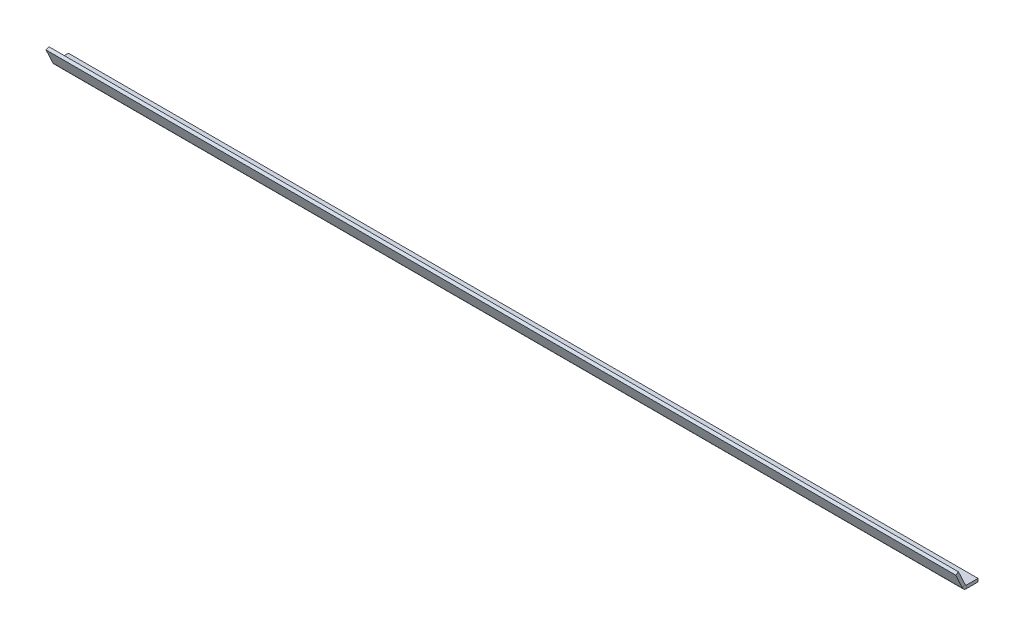
ISO-10303-21;
HEADER;
FILE_DESCRIPTION(('STEP AP214'),'2;1');
FILE_NAME('part.step','',(''),(''),'','','');
FILE_SCHEMA(('AUTOMOTIVE_DESIGN { 1 0 10303 214 1 1 1 1 }'));
ENDSEC;
DATA;
#1=APPLICATION_CONTEXT('core data for automotive mechanical design processes');
#2=APPLICATION_PROTOCOL_DEFINITION('international standard','automotive_design',2000,#1);
#3=PRODUCT_CONTEXT('',#1,'mechanical');
#4=PRODUCT('Part','Part','',(#3));
#5=PRODUCT_RELATED_PRODUCT_CATEGORY('part','',(#4));
#6=PRODUCT_DEFINITION_FORMATION('','',#4);
#7=PRODUCT_DEFINITION_CONTEXT('part definition',#1,'design');
#8=PRODUCT_DEFINITION('design','',#6,#7);
#9=PRODUCT_DEFINITION_SHAPE('','',#8);
#10=(LENGTH_UNIT() NAMED_UNIT(*) SI_UNIT(.MILLI.,.METRE.));
#11=(NAMED_UNIT(*) PLANE_ANGLE_UNIT() SI_UNIT($,.RADIAN.));
#12=(NAMED_UNIT(*) SI_UNIT($,.STERADIAN.) SOLID_ANGLE_UNIT());
#13=UNCERTAINTY_MEASURE_WITH_UNIT(LENGTH_MEASURE(1.E-05),#10,'distance_accuracy_value','');
#14=(GEOMETRIC_REPRESENTATION_CONTEXT(3) GLOBAL_UNCERTAINTY_ASSIGNED_CONTEXT((#13)) GLOBAL_UNIT_ASSIGNED_CONTEXT((#10,
#11,#12)) REPRESENTATION_CONTEXT('',''));
#15=CARTESIAN_POINT('',(0.,0.,0.));
#16=DIRECTION('',(0.,0.,1.));
#17=DIRECTION('',(1.,0.,0.));
#18=AXIS2_PLACEMENT_3D('',#15,#16,#17);
#19=CARTESIAN_POINT('',(1150.,-8.,-2.15248500708152E-13));
#20=DIRECTION('',(1.,0.,0.));
#21=DIRECTION('',(0.,0.,-1.));
#22=AXIS2_PLACEMENT_3D('',#19,#20,#21);
#23=PLANE('',#22);
#24=DIRECTION('',(0.,0.,-1.));
#25=VECTOR('',#24,1.);
#26=CARTESIAN_POINT('',(1150.,0.,-2.15248500708152E-13));
#27=LINE('',#26,#25);
#28=CARTESIAN_POINT('',(1150.,0.,-10.7382341341226));
#29=VERTEX_POINT('',#28);
#30=CARTESIAN_POINT('',(1150.,0.,-40.0000000000002));
#31=VERTEX_POINT('',#30);
#32=EDGE_CURVE('E113',#29,#31,#27,.T.);
#33=ORIENTED_EDGE('',*,*,#32,.F.);
#34=DIRECTION('',(0.,-1.,0.));
#35=VECTOR('',#34,1.);
#36=CARTESIAN_POINT('',(1150.,-1.44415729375069E-13,-10.7382341341226));
#37=LINE('',#36,#35);
#38=CARTESIAN_POINT('',(1150.,-8.00000000000015,-10.738234134123));
#39=VERTEX_POINT('',#38);
#40=EDGE_CURVE('E128',#29,#39,#37,.T.);
#41=ORIENTED_EDGE('',*,*,#40,.T.);
#42=DIRECTION('',(0.,0.,-1.));
#43=VECTOR('',#42,1.);
#44=CARTESIAN_POINT('',(1150.,-8.,-2.15248500708152E-13));
#45=LINE('',#44,#43);
#46=CARTESIAN_POINT('',(1150.,-8.,-40.0000000000002));
#47=VERTEX_POINT('',#46);
#48=EDGE_CURVE('E110',#39,#47,#45,.T.);
#49=ORIENTED_EDGE('',*,*,#48,.T.);
#50=DIRECTION('',(0.,1.,0.));
#51=VECTOR('',#50,1.);
#52=CARTESIAN_POINT('',(1150.,-8.,-40.0000000000002));
#53=LINE('',#52,#51);
#54=EDGE_CURVE('E66',#47,#31,#53,.T.);
#55=ORIENTED_EDGE('',*,*,#54,.T.);
#56=EDGE_LOOP('',(#33,#41,#49,#55));
#57=FACE_BOUND('',#56,.T.);
#58=ADVANCED_FACE('F63',(#57),#23,.T.);
#59=CARTESIAN_POINT('',(0.,-8.,0.));
#60=DIRECTION('',(0.,1.,0.));
#61=DIRECTION('',(0.,0.,1.));
#62=AXIS2_PLACEMENT_3D('',#59,#60,#61);
#63=PLANE('',#62);
#64=DIRECTION('',(1.,0.,0.));
#65=VECTOR('',#64,1.);
#66=CARTESIAN_POINT('',(1150.,-8.00000000000015,-10.738234134123));
#67=LINE('',#66,#65);
#68=CARTESIAN_POINT('',(-1150.,-8.,-10.7382341341226));
#69=VERTEX_POINT('',#68);
#70=EDGE_CURVE('E150',#39,#69,#67,.F.);
#71=ORIENTED_EDGE('',*,*,#70,.T.);
#72=DIRECTION('',(0.,0.,1.));
#73=VECTOR('',#72,1.);
#74=CARTESIAN_POINT('',(-1150.,-8.,0.));
#75=LINE('',#74,#73);
#76=CARTESIAN_POINT('',(-1150.,-8.,-39.9999999999999));
#77=VERTEX_POINT('',#76);
#78=EDGE_CURVE('E121',#77,#69,#75,.T.);
#79=ORIENTED_EDGE('',*,*,#78,.F.);
#80=DIRECTION('',(-1.,0.,0.));
#81=VECTOR('',#80,1.);
#82=CARTESIAN_POINT('',(1150.,-8.,-40.0000000000002));
#83=LINE('',#82,#81);
#84=EDGE_CURVE('E102',#47,#77,#83,.T.);
#85=ORIENTED_EDGE('',*,*,#84,.F.);
#86=ORIENTED_EDGE('',*,*,#48,.F.);
#87=EDGE_LOOP('',(#71,#79,#85,#86));
#88=FACE_BOUND('',#87,.T.);
#89=ADVANCED_FACE('F243',(#88),#63,.F.);
#90=CARTESIAN_POINT('',(0.,0.,0.));
#91=DIRECTION('',(0.,1.,0.));
#92=DIRECTION('',(0.,0.,1.));
#93=AXIS2_PLACEMENT_3D('',#90,#91,#92);
#94=PLANE('',#93);
#95=DIRECTION('',(0.,0.,1.));
#96=VECTOR('',#95,1.);
#97=CARTESIAN_POINT('',(-1150.,0.,0.));
#98=LINE('',#97,#96);
#99=CARTESIAN_POINT('',(-1150.,0.,-39.9999999999999));
#100=VERTEX_POINT('',#99);
#101=CARTESIAN_POINT('',(-1150.,-1.44415729375069E-13,-10.7382341341226));
#102=VERTEX_POINT('',#101);
#103=EDGE_CURVE('E104',#100,#102,#98,.T.);
#104=ORIENTED_EDGE('',*,*,#103,.T.);
#105=DIRECTION('',(1.,0.,0.));
#106=VECTOR('',#105,1.);
#107=CARTESIAN_POINT('',(1150.,-1.44415729375069E-13,-10.7382341341226));
#108=LINE('',#107,#106);
#109=EDGE_CURVE('E78',#29,#102,#108,.F.);
#110=ORIENTED_EDGE('',*,*,#109,.F.);
#111=ORIENTED_EDGE('',*,*,#32,.T.);
#112=DIRECTION('',(-1.,0.,0.));
#113=VECTOR('',#112,1.);
#114=CARTESIAN_POINT('',(1150.,0.,-40.0000000000002));
#115=LINE('',#114,#113);
#116=EDGE_CURVE('E100',#31,#100,#115,.T.);
#117=ORIENTED_EDGE('',*,*,#116,.T.);
#118=EDGE_LOOP('',(#104,#110,#111,#117));
#119=FACE_BOUND('',#118,.T.);
#120=ADVANCED_FACE('F112',(#119),#94,.T.);
#121=CARTESIAN_POINT('',(-1150.,-8.,0.));
#122=DIRECTION('',(-1.,0.,0.));
#123=DIRECTION('',(0.,0.,1.));
#124=AXIS2_PLACEMENT_3D('',#121,#122,#123);
#125=PLANE('',#124);
#126=DIRECTION('',(0.,-1.,0.));
#127=VECTOR('',#126,1.);
#128=CARTESIAN_POINT('',(-1150.,-1.44415729375069E-13,-10.7382341341226));
#129=LINE('',#128,#127);
#130=EDGE_CURVE('E108',#102,#69,#129,.T.);
#131=ORIENTED_EDGE('',*,*,#130,.F.);
#132=ORIENTED_EDGE('',*,*,#103,.F.);
#133=DIRECTION('',(0.,1.,0.));
#134=VECTOR('',#133,1.);
#135=CARTESIAN_POINT('',(-1150.,-8.,-39.9999999999999));
#136=LINE('',#135,#134);
#137=EDGE_CURVE('E13',#77,#100,#136,.T.);
#138=ORIENTED_EDGE('',*,*,#137,.F.);
#139=ORIENTED_EDGE('',*,*,#78,.T.);
#140=EDGE_LOOP('',(#131,#132,#138,#139));
#141=FACE_BOUND('',#140,.T.);
#142=ADVANCED_FACE('F105',(#141),#125,.T.);
#143=CARTESIAN_POINT('',(1150.,-8.,-40.0000000000002));
#144=DIRECTION('',(0.,0.,-1.));
#145=DIRECTION('',(-1.,0.,0.));
#146=AXIS2_PLACEMENT_3D('',#143,#144,#145);
#147=PLANE('',#146);
#148=ORIENTED_EDGE('',*,*,#116,.F.);
#149=ORIENTED_EDGE('',*,*,#54,.F.);
#150=ORIENTED_EDGE('',*,*,#84,.T.);
#151=ORIENTED_EDGE('',*,*,#137,.T.);
#152=EDGE_LOOP('',(#148,#149,#150,#151));
#153=FACE_BOUND('',#152,.T.);
#154=ADVANCED_FACE('F97',(#153),#147,.T.);
#155=CARTESIAN_POINT('',(-1150.,2.99999999999998,-10.7382341341224));
#156=DIRECTION('',(-1.,0.,0.));
#157=DIRECTION('',(0.,0.,1.));
#158=AXIS2_PLACEMENT_3D('',#155,#156,#157);
#159=PLANE('',#158);
#160=DIRECTION('',(0.,0.422618261740704,-0.906307787036648));
#161=VECTOR('',#160,1.);
#162=CARTESIAN_POINT('',(-1150.,-1.64880087914773,-0.768848476719149));
#163=LINE('',#162,#161);
#164=CARTESIAN_POINT('',(-1150.,1.73214521477782,-8.01931077301239));
#165=VERTEX_POINT('',#164);
#166=CARTESIAN_POINT('',(-1150.,-1.64880087914781,-0.768848476719203));
#167=VERTEX_POINT('',#166);
#168=EDGE_CURVE('E157',#165,#167,#163,.F.);
#169=ORIENTED_EDGE('',*,*,#168,.F.);
#170=CARTESIAN_POINT('',(-1150.,2.99999999999998,-10.7382341341224));
#171=DIRECTION('',(1.,0.,0.));
#172=DIRECTION('',(0.,0.,-1.));
#173=AXIS2_PLACEMENT_3D('',#170,#171,#172);
#174=CIRCLE('',#173,3.00000000000013);
#175=EDGE_CURVE('E142',#102,#165,#174,.F.);
#176=ORIENTED_EDGE('',*,*,#175,.F.);
#177=ORIENTED_EDGE('',*,*,#130,.T.);
#178=CARTESIAN_POINT('',(-1150.,2.99999999999998,-10.7382341341224));
#179=DIRECTION('',(1.,0.,0.));
#180=DIRECTION('',(0.,0.,-1.));
#181=AXIS2_PLACEMENT_3D('',#178,#179,#180);
#182=CIRCLE('',#181,11.0000000000001);
#183=EDGE_CURVE('E132',#69,#167,#182,.F.);
#184=ORIENTED_EDGE('',*,*,#183,.T.);
#185=EDGE_LOOP('',(#169,#176,#177,#184));
#186=FACE_BOUND('',#185,.T.);
#187=ADVANCED_FACE('F247',(#186),#159,.T.);
#188=CARTESIAN_POINT('',(1150.,2.99999999999998,-10.7382341341224));
#189=DIRECTION('',(-1.,0.,0.));
#190=DIRECTION('',(0.,0.,1.));
#191=AXIS2_PLACEMENT_3D('',#188,#189,#190);
#192=PLANE('',#191);
#193=CARTESIAN_POINT('',(1150.,2.99999999999998,-10.7382341341224));
#194=DIRECTION('',(1.,0.,0.));
#195=DIRECTION('',(0.,0.,-1.));
#196=AXIS2_PLACEMENT_3D('',#193,#194,#195);
#197=CIRCLE('',#196,3.00000000000013);
#198=CARTESIAN_POINT('',(1150.,1.73214521477782,-8.01931077301239));
#199=VERTEX_POINT('',#198);
#200=EDGE_CURVE('E135',#199,#29,#197,.T.);
#201=ORIENTED_EDGE('',*,*,#200,.F.);
#202=DIRECTION('',(0.,0.422618261740704,-0.906307787036648));
#203=VECTOR('',#202,1.);
#204=CARTESIAN_POINT('',(1150.,1.73214521477785,-8.01931077301267));
#205=LINE('',#204,#203);
#206=CARTESIAN_POINT('',(1150.,-1.6488008791478,-0.768848476719464));
#207=VERTEX_POINT('',#206);
#208=EDGE_CURVE('E165',#199,#207,#205,.F.);
#209=ORIENTED_EDGE('',*,*,#208,.T.);
#210=CARTESIAN_POINT('',(1150.,2.99999999999998,-10.7382341341224));
#211=DIRECTION('',(1.,0.,0.));
#212=DIRECTION('',(0.,0.,-1.));
#213=AXIS2_PLACEMENT_3D('',#210,#211,#212);
#214=CIRCLE('',#213,11.0000000000001);
#215=EDGE_CURVE('E146',#207,#39,#214,.T.);
#216=ORIENTED_EDGE('',*,*,#215,.T.);
#217=ORIENTED_EDGE('',*,*,#40,.F.);
#218=EDGE_LOOP('',(#201,#209,#216,#217));
#219=FACE_BOUND('',#218,.T.);
#220=ADVANCED_FACE('F257',(#219),#192,.F.);
#221=CARTESIAN_POINT('',(1150.,2.99999999999998,-10.7382341341224));
#222=DIRECTION('',(1.,0.,0.));
#223=DIRECTION('',(0.,-0.422618261740704,0.906307787036648));
#224=AXIS2_PLACEMENT_3D('',#221,#222,#223);
#225=CYLINDRICAL_SURFACE('',#224,11.0000000000001);
#226=ORIENTED_EDGE('',*,*,#70,.F.);
#227=ORIENTED_EDGE('',*,*,#215,.F.);
#228=DIRECTION('',(1.,0.,0.));
#229=VECTOR('',#228,1.);
#230=CARTESIAN_POINT('',(-1150.,-1.64880087914773,-0.768848476719148));
#231=LINE('',#230,#229);
#232=EDGE_CURVE('E169',#207,#167,#231,.F.);
#233=ORIENTED_EDGE('',*,*,#232,.T.);
#234=ORIENTED_EDGE('',*,*,#183,.F.);
#235=EDGE_LOOP('',(#226,#227,#233,#234));
#236=FACE_BOUND('',#235,.T.);
#237=ADVANCED_FACE('F248',(#236),#225,.T.);
#238=CARTESIAN_POINT('',(1150.,2.99999999999998,-10.7382341341224));
#239=DIRECTION('',(1.,0.,0.));
#240=DIRECTION('',(0.,-0.422618261740704,0.906307787036648));
#241=AXIS2_PLACEMENT_3D('',#238,#239,#240);
#242=CYLINDRICAL_SURFACE('',#241,3.00000000000013);
#243=ORIENTED_EDGE('',*,*,#109,.T.);
#244=ORIENTED_EDGE('',*,*,#175,.T.);
#245=DIRECTION('',(1.,0.,0.));
#246=VECTOR('',#245,1.);
#247=CARTESIAN_POINT('',(-1150.,1.73214521477791,-8.01931077301236));
#248=LINE('',#247,#246);
#249=EDGE_CURVE('E161',#165,#199,#248,.T.);
#250=ORIENTED_EDGE('',*,*,#249,.T.);
#251=ORIENTED_EDGE('',*,*,#200,.T.);
#252=EDGE_LOOP('',(#243,#244,#250,#251));
#253=FACE_BOUND('',#252,.T.);
#254=ADVANCED_FACE('F260',(#253),#242,.F.);
#255=CARTESIAN_POINT('',(-1150.,-3.38094609392566,-1.57656105540664));
#256=DIRECTION('',(1.,0.,0.));
#257=DIRECTION('',(0.,0.,-1.));
#258=AXIS2_PLACEMENT_3D('',#255,#256,#257);
#259=PLANE('',#258);
#260=ORIENTED_EDGE('',*,*,#168,.T.);
#261=DIRECTION('',(0.,-0.906307787036648,-0.422618261740704));
#262=VECTOR('',#261,1.);
#263=CARTESIAN_POINT('',(-1150.,-3.38094609392569,-1.57656105540665));
#264=LINE('',#263,#262);
#265=CARTESIAN_POINT('',(-1150.,35.5027737777591,16.5552152983139));
#266=VERTEX_POINT('',#265);
#267=EDGE_CURVE('E185',#266,#167,#264,.T.);
#268=ORIENTED_EDGE('',*,*,#267,.F.);
#269=DIRECTION('',(0.,0.422618261740704,-0.906307787036648));
#270=VECTOR('',#269,1.);
#271=CARTESIAN_POINT('',(-1150.,35.5027737777591,16.5552152983139));
#272=LINE('',#271,#270);
#273=CARTESIAN_POINT('',(-1150.,38.8837198716847,9.3047530020207));
#274=VERTEX_POINT('',#273);
#275=EDGE_CURVE('E197',#266,#274,#272,.T.);
#276=ORIENTED_EDGE('',*,*,#275,.T.);
#277=DIRECTION('',(0.,0.906307787036648,0.422618261740704));
#278=VECTOR('',#277,1.);
#279=CARTESIAN_POINT('',(-1150.,0.,-8.82702335169983));
#280=LINE('',#279,#278);
#281=EDGE_CURVE('E173',#274,#165,#280,.F.);
#282=ORIENTED_EDGE('',*,*,#281,.T.);
#283=EDGE_LOOP('',(#260,#268,#276,#282));
#284=FACE_BOUND('',#283,.T.);
#285=ADVANCED_FACE('F226',(#284),#259,.F.);
#286=CARTESIAN_POINT('',(1150.,35.5027737777591,16.5552152983136));
#287=DIRECTION('',(-1.,0.,0.));
#288=DIRECTION('',(0.,-1.,0.));
#289=AXIS2_PLACEMENT_3D('',#286,#287,#288);
#290=PLANE('',#289);
#291=ORIENTED_EDGE('',*,*,#208,.F.);
#292=DIRECTION('',(0.,-0.906307787036648,-0.422618261740704));
#293=VECTOR('',#292,1.);
#294=CARTESIAN_POINT('',(1150.,38.8837198716847,9.30475300202042));
#295=LINE('',#294,#293);
#296=CARTESIAN_POINT('',(1150.,38.8837198716847,9.30475300202042));
#297=VERTEX_POINT('',#296);
#298=EDGE_CURVE('E177',#199,#297,#295,.F.);
#299=ORIENTED_EDGE('',*,*,#298,.T.);
#300=DIRECTION('',(0.,0.422618261740704,-0.906307787036648));
#301=VECTOR('',#300,1.);
#302=CARTESIAN_POINT('',(1150.,35.5027737777591,16.5552152983136));
#303=LINE('',#302,#301);
#304=CARTESIAN_POINT('',(1150.,35.5027737777591,16.5552152983136));
#305=VERTEX_POINT('',#304);
#306=EDGE_CURVE('E139',#305,#297,#303,.T.);
#307=ORIENTED_EDGE('',*,*,#306,.F.);
#308=DIRECTION('',(0.,0.906307787036648,0.422618261740704));
#309=VECTOR('',#308,1.);
#310=CARTESIAN_POINT('',(1150.,-3.38094609392018,-1.57656105540437));
#311=LINE('',#310,#309);
#312=EDGE_CURVE('E189',#207,#305,#311,.T.);
#313=ORIENTED_EDGE('',*,*,#312,.F.);
#314=EDGE_LOOP('',(#291,#299,#307,#313));
#315=FACE_BOUND('',#314,.T.);
#316=ADVANCED_FACE('F254',(#315),#290,.F.);
#317=CARTESIAN_POINT('',(0.,-3.38094609392563,-1.57656105540677));
#318=DIRECTION('',(0.,0.422618261740704,-0.906307787036648));
#319=DIRECTION('',(0.,0.906307787036648,0.422618261740704));
#320=AXIS2_PLACEMENT_3D('',#317,#318,#319);
#321=PLANE('',#320);
#322=ORIENTED_EDGE('',*,*,#232,.F.);
#323=ORIENTED_EDGE('',*,*,#312,.T.);
#324=DIRECTION('',(-1.,0.,0.));
#325=VECTOR('',#324,1.);
#326=CARTESIAN_POINT('',(0.,35.5027737777591,16.5552152983137));
#327=LINE('',#326,#325);
#328=EDGE_CURVE('E193',#305,#266,#327,.T.);
#329=ORIENTED_EDGE('',*,*,#328,.T.);
#330=ORIENTED_EDGE('',*,*,#267,.T.);
#331=EDGE_LOOP('',(#322,#323,#329,#330));
#332=FACE_BOUND('',#331,.T.);
#333=ADVANCED_FACE('F251',(#332),#321,.F.);
#334=CARTESIAN_POINT('',(0.,0.,-8.82702335169995));
#335=DIRECTION('',(0.,0.422618261740704,-0.906307787036648));
#336=DIRECTION('',(0.,0.906307787036648,0.422618261740704));
#337=AXIS2_PLACEMENT_3D('',#334,#335,#336);
#338=PLANE('',#337);
#339=ORIENTED_EDGE('',*,*,#298,.F.);
#340=ORIENTED_EDGE('',*,*,#249,.F.);
#341=ORIENTED_EDGE('',*,*,#281,.F.);
#342=DIRECTION('',(1.,0.,0.));
#343=VECTOR('',#342,1.);
#344=CARTESIAN_POINT('',(-1150.,38.8837198716847,9.3047530020207));
#345=LINE('',#344,#343);
#346=EDGE_CURVE('E181',#297,#274,#345,.F.);
#347=ORIENTED_EDGE('',*,*,#346,.F.);
#348=EDGE_LOOP('',(#339,#340,#341,#347));
#349=FACE_BOUND('',#348,.T.);
#350=ADVANCED_FACE('F220',(#349),#338,.T.);
#351=CARTESIAN_POINT('',(-1150.,35.5027737777591,16.5552152983139));
#352=DIRECTION('',(0.,-0.906307787036648,-0.422618261740704));
#353=DIRECTION('',(0.,0.422618261740704,-0.906307787036648));
#354=AXIS2_PLACEMENT_3D('',#351,#352,#353);
#355=PLANE('',#354);
#356=ORIENTED_EDGE('',*,*,#346,.T.);
#357=ORIENTED_EDGE('',*,*,#275,.F.);
#358=ORIENTED_EDGE('',*,*,#328,.F.);
#359=ORIENTED_EDGE('',*,*,#306,.T.);
#360=EDGE_LOOP('',(#356,#357,#358,#359));
#361=FACE_BOUND('',#360,.T.);
#362=ADVANCED_FACE('F209',(#361),#355,.F.);
#363=CLOSED_SHELL('',(#58,#89,#120,#142,#154,#187,#220,#237,#254,#285,#316,#333,#350,#362));
#364=MANIFOLD_SOLID_BREP('B2',#363);
#365=ADVANCED_BREP_SHAPE_REPRESENTATION('',(#18,#364),#14);
#366=SHAPE_DEFINITION_REPRESENTATION(#9,#365);
ENDSEC;
END-ISO-10303-21;
